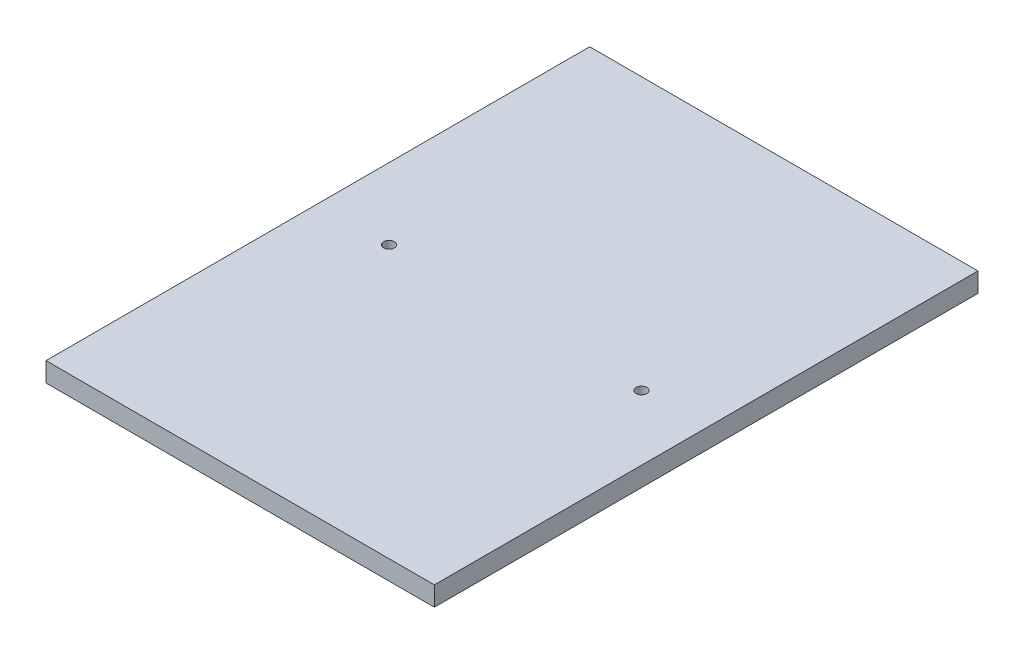
ISO-10303-21;
HEADER;
FILE_DESCRIPTION(('STEP AP214'),'2;1');
FILE_NAME('part.step','',(''),(''),'','','');
FILE_SCHEMA(('AUTOMOTIVE_DESIGN { 1 0 10303 214 1 1 1 1 }'));
ENDSEC;
DATA;
#1=APPLICATION_CONTEXT('core data for automotive mechanical design processes');
#2=APPLICATION_PROTOCOL_DEFINITION('international standard','automotive_design',2000,#1);
#3=PRODUCT_CONTEXT('',#1,'mechanical');
#4=PRODUCT('Part','Part','',(#3));
#5=PRODUCT_RELATED_PRODUCT_CATEGORY('part','',(#4));
#6=PRODUCT_DEFINITION_FORMATION('','',#4);
#7=PRODUCT_DEFINITION_CONTEXT('part definition',#1,'design');
#8=PRODUCT_DEFINITION('design','',#6,#7);
#9=PRODUCT_DEFINITION_SHAPE('','',#8);
#10=(LENGTH_UNIT() NAMED_UNIT(*) SI_UNIT(.MILLI.,.METRE.));
#11=(NAMED_UNIT(*) PLANE_ANGLE_UNIT() SI_UNIT($,.RADIAN.));
#12=(NAMED_UNIT(*) SI_UNIT($,.STERADIAN.) SOLID_ANGLE_UNIT());
#13=UNCERTAINTY_MEASURE_WITH_UNIT(LENGTH_MEASURE(1.E-05),#10,'distance_accuracy_value','');
#14=(GEOMETRIC_REPRESENTATION_CONTEXT(3) GLOBAL_UNCERTAINTY_ASSIGNED_CONTEXT((#13)) GLOBAL_UNIT_ASSIGNED_CONTEXT((#10,
#11,#12)) REPRESENTATION_CONTEXT('',''));
#15=CARTESIAN_POINT('',(0.,0.,0.));
#16=DIRECTION('',(0.,0.,1.));
#17=DIRECTION('',(1.,0.,0.));
#18=AXIS2_PLACEMENT_3D('',#15,#16,#17);
#19=CARTESIAN_POINT('',(-90.,4.5,-126.));
#20=DIRECTION('',(1.,0.,0.));
#21=DIRECTION('',(0.,0.,-1.));
#22=AXIS2_PLACEMENT_3D('',#19,#20,#21);
#23=PLANE('',#22);
#24=DIRECTION('',(0.,0.,1.));
#25=VECTOR('',#24,1.);
#26=CARTESIAN_POINT('',(-90.,-4.5,-126.));
#27=LINE('',#26,#25);
#28=CARTESIAN_POINT('',(-90.,-4.5,-126.));
#29=VERTEX_POINT('',#28);
#30=CARTESIAN_POINT('',(-90.,-4.5,126.));
#31=VERTEX_POINT('',#30);
#32=EDGE_CURVE('E98',#29,#31,#27,.T.);
#33=ORIENTED_EDGE('',*,*,#32,.T.);
#34=DIRECTION('',(0.,-1.,0.));
#35=VECTOR('',#34,1.);
#36=CARTESIAN_POINT('',(-90.,4.5,126.));
#37=LINE('',#36,#35);
#38=CARTESIAN_POINT('',(-90.,4.5,126.));
#39=VERTEX_POINT('',#38);
#40=EDGE_CURVE('E11',#39,#31,#37,.T.);
#41=ORIENTED_EDGE('',*,*,#40,.F.);
#42=DIRECTION('',(0.,0.,1.));
#43=VECTOR('',#42,1.);
#44=CARTESIAN_POINT('',(-90.,4.5,-126.));
#45=LINE('',#44,#43);
#46=CARTESIAN_POINT('',(-90.,4.5,-126.));
#47=VERTEX_POINT('',#46);
#48=EDGE_CURVE('E86',#47,#39,#45,.T.);
#49=ORIENTED_EDGE('',*,*,#48,.F.);
#50=DIRECTION('',(0.,-1.,0.));
#51=VECTOR('',#50,1.);
#52=CARTESIAN_POINT('',(-90.,4.5,-126.));
#53=LINE('',#52,#51);
#54=EDGE_CURVE('E94',#47,#29,#53,.T.);
#55=ORIENTED_EDGE('',*,*,#54,.T.);
#56=EDGE_LOOP('',(#33,#41,#49,#55));
#57=FACE_BOUND('',#56,.T.);
#58=ADVANCED_FACE('F35',(#57),#23,.F.);
#59=CARTESIAN_POINT('',(-90.,4.5,126.));
#60=DIRECTION('',(0.,0.,-1.));
#61=DIRECTION('',(-1.,0.,0.));
#62=AXIS2_PLACEMENT_3D('',#59,#60,#61);
#63=PLANE('',#62);
#64=DIRECTION('',(1.,0.,0.));
#65=VECTOR('',#64,1.);
#66=CARTESIAN_POINT('',(-90.,-4.5,126.));
#67=LINE('',#66,#65);
#68=CARTESIAN_POINT('',(90.,-4.5,126.));
#69=VERTEX_POINT('',#68);
#70=EDGE_CURVE('E90',#31,#69,#67,.T.);
#71=ORIENTED_EDGE('',*,*,#70,.T.);
#72=DIRECTION('',(0.,-1.,0.));
#73=VECTOR('',#72,1.);
#74=CARTESIAN_POINT('',(90.,4.5,126.));
#75=LINE('',#74,#73);
#76=CARTESIAN_POINT('',(90.,4.5,126.));
#77=VERTEX_POINT('',#76);
#78=EDGE_CURVE('E43',#77,#69,#75,.T.);
#79=ORIENTED_EDGE('',*,*,#78,.F.);
#80=DIRECTION('',(1.,0.,0.));
#81=VECTOR('',#80,1.);
#82=CARTESIAN_POINT('',(-90.,4.5,126.));
#83=LINE('',#82,#81);
#84=EDGE_CURVE('E81',#39,#77,#83,.T.);
#85=ORIENTED_EDGE('',*,*,#84,.F.);
#86=ORIENTED_EDGE('',*,*,#40,.T.);
#87=EDGE_LOOP('',(#71,#79,#85,#86));
#88=FACE_BOUND('',#87,.T.);
#89=ADVANCED_FACE('F89',(#88),#63,.F.);
#90=CARTESIAN_POINT('',(90.,4.5,-126.));
#91=DIRECTION('',(-1.,0.,0.));
#92=DIRECTION('',(0.,0.,1.));
#93=AXIS2_PLACEMENT_3D('',#90,#91,#92);
#94=PLANE('',#93);
#95=DIRECTION('',(0.,0.,-1.));
#96=VECTOR('',#95,1.);
#97=CARTESIAN_POINT('',(90.,-4.5,-126.));
#98=LINE('',#97,#96);
#99=CARTESIAN_POINT('',(90.,-4.5,-126.));
#100=VERTEX_POINT('',#99);
#101=EDGE_CURVE('E68',#69,#100,#98,.T.);
#102=ORIENTED_EDGE('',*,*,#101,.T.);
#103=DIRECTION('',(0.,-1.,0.));
#104=VECTOR('',#103,1.);
#105=CARTESIAN_POINT('',(90.,4.5,-126.));
#106=LINE('',#105,#104);
#107=CARTESIAN_POINT('',(90.,4.5,-126.));
#108=VERTEX_POINT('',#107);
#109=EDGE_CURVE('E91',#108,#100,#106,.T.);
#110=ORIENTED_EDGE('',*,*,#109,.F.);
#111=DIRECTION('',(0.,0.,-1.));
#112=VECTOR('',#111,1.);
#113=CARTESIAN_POINT('',(90.,4.5,-126.));
#114=LINE('',#113,#112);
#115=EDGE_CURVE('E84',#77,#108,#114,.T.);
#116=ORIENTED_EDGE('',*,*,#115,.F.);
#117=ORIENTED_EDGE('',*,*,#78,.T.);
#118=EDGE_LOOP('',(#102,#110,#116,#117));
#119=FACE_BOUND('',#118,.T.);
#120=ADVANCED_FACE('F92',(#119),#94,.F.);
#121=CARTESIAN_POINT('',(-90.,4.5,-126.));
#122=DIRECTION('',(0.,0.,1.));
#123=DIRECTION('',(1.,0.,0.));
#124=AXIS2_PLACEMENT_3D('',#121,#122,#123);
#125=PLANE('',#124);
#126=DIRECTION('',(-1.,0.,0.));
#127=VECTOR('',#126,1.);
#128=CARTESIAN_POINT('',(-90.,-4.5,-126.));
#129=LINE('',#128,#127);
#130=EDGE_CURVE('E74',#100,#29,#129,.T.);
#131=ORIENTED_EDGE('',*,*,#130,.T.);
#132=ORIENTED_EDGE('',*,*,#54,.F.);
#133=DIRECTION('',(-1.,0.,0.));
#134=VECTOR('',#133,1.);
#135=CARTESIAN_POINT('',(-90.,4.5,-126.));
#136=LINE('',#135,#134);
#137=EDGE_CURVE('E51',#108,#47,#136,.T.);
#138=ORIENTED_EDGE('',*,*,#137,.F.);
#139=ORIENTED_EDGE('',*,*,#109,.T.);
#140=EDGE_LOOP('',(#131,#132,#138,#139));
#141=FACE_BOUND('',#140,.T.);
#142=ADVANCED_FACE('F106',(#141),#125,.F.);
#143=CARTESIAN_POINT('',(0.,4.5,0.));
#144=DIRECTION('',(0.,1.,0.));
#145=DIRECTION('',(0.,0.,1.));
#146=AXIS2_PLACEMENT_3D('',#143,#144,#145);
#147=PLANE('',#146);
#148=CARTESIAN_POINT('',(-57.,4.5,0.));
#149=DIRECTION('',(0.,1.,0.));
#150=DIRECTION('',(0.,0.,1.));
#151=AXIS2_PLACEMENT_3D('',#148,#149,#150);
#152=CIRCLE('',#151,2.5);
#153=CARTESIAN_POINT('',(-57.,4.5,2.50000000000002));
#154=VERTEX_POINT('',#153);
#155=EDGE_CURVE('E118',#154,#154,#152,.T.);
#156=ORIENTED_EDGE('',*,*,#155,.F.);
#157=EDGE_LOOP('',(#156));
#158=FACE_BOUND('',#157,.T.);
#159=CARTESIAN_POINT('',(60.,4.5,0.));
#160=DIRECTION('',(0.,1.,0.));
#161=DIRECTION('',(0.,0.,1.));
#162=AXIS2_PLACEMENT_3D('',#159,#160,#161);
#163=CIRCLE('',#162,2.5);
#164=CARTESIAN_POINT('',(60.,4.5,2.5));
#165=VERTEX_POINT('',#164);
#166=EDGE_CURVE('E112',#165,#165,#163,.T.);
#167=ORIENTED_EDGE('',*,*,#166,.F.);
#168=EDGE_LOOP('',(#167));
#169=FACE_BOUND('',#168,.T.);
#170=ORIENTED_EDGE('',*,*,#48,.T.);
#171=ORIENTED_EDGE('',*,*,#84,.T.);
#172=ORIENTED_EDGE('',*,*,#115,.T.);
#173=ORIENTED_EDGE('',*,*,#137,.T.);
#174=EDGE_LOOP('',(#170,#171,#172,#173));
#175=FACE_BOUND('',#174,.T.);
#176=ADVANCED_FACE('F82',(#158,#169,#175),#147,.T.);
#177=CARTESIAN_POINT('',(0.,-4.5,0.));
#178=DIRECTION('',(0.,1.,0.));
#179=DIRECTION('',(0.,0.,1.));
#180=AXIS2_PLACEMENT_3D('',#177,#178,#179);
#181=PLANE('',#180);
#182=CARTESIAN_POINT('',(-57.,-4.5,0.));
#183=DIRECTION('',(0.,1.,0.));
#184=DIRECTION('',(0.,0.,1.));
#185=AXIS2_PLACEMENT_3D('',#182,#183,#184);
#186=CIRCLE('',#185,2.5);
#187=CARTESIAN_POINT('',(-57.,-4.5,2.50000000000002));
#188=VERTEX_POINT('',#187);
#189=EDGE_CURVE('E115',#188,#188,#186,.T.);
#190=ORIENTED_EDGE('',*,*,#189,.T.);
#191=EDGE_LOOP('',(#190));
#192=FACE_BOUND('',#191,.T.);
#193=CARTESIAN_POINT('',(60.,-4.5,0.));
#194=DIRECTION('',(0.,1.,0.));
#195=DIRECTION('',(0.,0.,1.));
#196=AXIS2_PLACEMENT_3D('',#193,#194,#195);
#197=CIRCLE('',#196,2.5);
#198=CARTESIAN_POINT('',(60.,-4.5,2.5));
#199=VERTEX_POINT('',#198);
#200=EDGE_CURVE('E101',#199,#199,#197,.T.);
#201=ORIENTED_EDGE('',*,*,#200,.T.);
#202=EDGE_LOOP('',(#201));
#203=FACE_BOUND('',#202,.T.);
#204=ORIENTED_EDGE('',*,*,#32,.F.);
#205=ORIENTED_EDGE('',*,*,#130,.F.);
#206=ORIENTED_EDGE('',*,*,#101,.F.);
#207=ORIENTED_EDGE('',*,*,#70,.F.);
#208=EDGE_LOOP('',(#204,#205,#206,#207));
#209=FACE_BOUND('',#208,.T.);
#210=ADVANCED_FACE('F109',(#192,#203,#209),#181,.F.);
#211=CARTESIAN_POINT('',(60.,-4.5,0.));
#212=DIRECTION('',(0.,1.,0.));
#213=DIRECTION('',(0.,0.,1.));
#214=AXIS2_PLACEMENT_3D('',#211,#212,#213);
#215=CYLINDRICAL_SURFACE('',#214,2.5);
#216=ORIENTED_EDGE('',*,*,#200,.F.);
#217=EDGE_LOOP('',(#216));
#218=FACE_BOUND('',#217,.T.);
#219=ORIENTED_EDGE('',*,*,#166,.T.);
#220=EDGE_LOOP('',(#219));
#221=FACE_BOUND('',#220,.T.);
#222=ADVANCED_FACE('F129',(#218,#221),#215,.F.);
#223=CARTESIAN_POINT('',(-57.,-4.5,0.));
#224=DIRECTION('',(0.,1.,0.));
#225=DIRECTION('',(0.,0.,1.));
#226=AXIS2_PLACEMENT_3D('',#223,#224,#225);
#227=CYLINDRICAL_SURFACE('',#226,2.5);
#228=ORIENTED_EDGE('',*,*,#189,.F.);
#229=EDGE_LOOP('',(#228));
#230=FACE_BOUND('',#229,.T.);
#231=ORIENTED_EDGE('',*,*,#155,.T.);
#232=EDGE_LOOP('',(#231));
#233=FACE_BOUND('',#232,.T.);
#234=ADVANCED_FACE('F126',(#230,#233),#227,.F.);
#235=CLOSED_SHELL('',(#58,#89,#120,#142,#176,#210,#222,#234));
#236=MANIFOLD_SOLID_BREP('B2',#235);
#237=ADVANCED_BREP_SHAPE_REPRESENTATION('',(#18,#236),#14);
#238=SHAPE_DEFINITION_REPRESENTATION(#9,#237);
ENDSEC;
END-ISO-10303-21;
